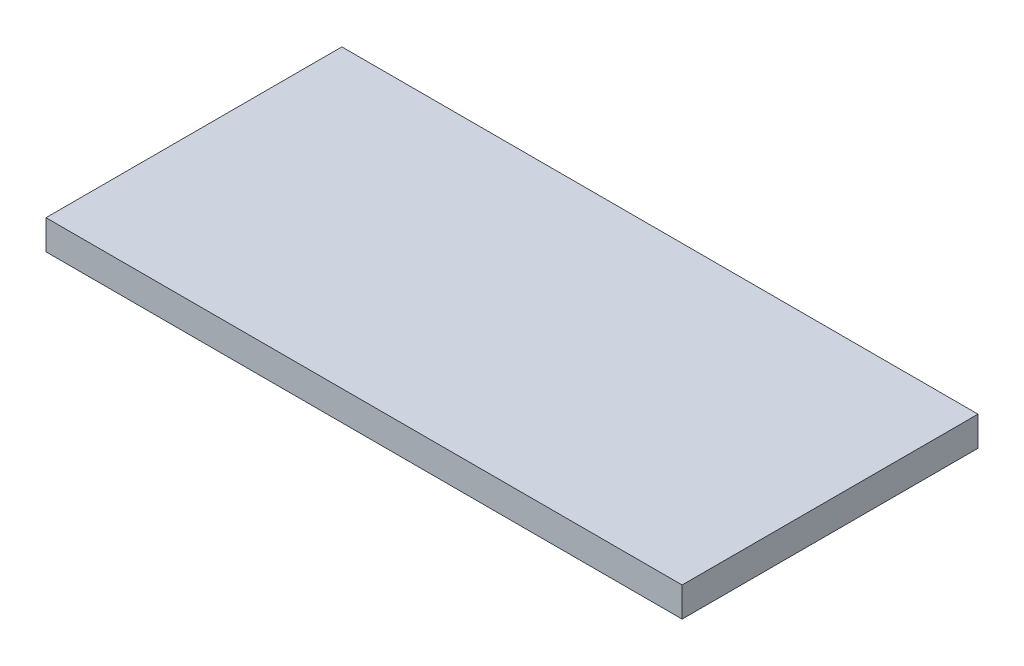
ISO-10303-21;
HEADER;
FILE_DESCRIPTION(('STEP AP214'),'2;1');
FILE_NAME('part.step','',(''),(''),'','','');
FILE_SCHEMA(('AUTOMOTIVE_DESIGN { 1 0 10303 214 1 1 1 1 }'));
ENDSEC;
DATA;
#1=APPLICATION_CONTEXT('core data for automotive mechanical design processes');
#2=APPLICATION_PROTOCOL_DEFINITION('international standard','automotive_design',2000,#1);
#3=PRODUCT_CONTEXT('',#1,'mechanical');
#4=PRODUCT('Part','Part','',(#3));
#5=PRODUCT_RELATED_PRODUCT_CATEGORY('part','',(#4));
#6=PRODUCT_DEFINITION_FORMATION('','',#4);
#7=PRODUCT_DEFINITION_CONTEXT('part definition',#1,'design');
#8=PRODUCT_DEFINITION('design','',#6,#7);
#9=PRODUCT_DEFINITION_SHAPE('','',#8);
#10=(LENGTH_UNIT() NAMED_UNIT(*) SI_UNIT(.MILLI.,.METRE.));
#11=(NAMED_UNIT(*) PLANE_ANGLE_UNIT() SI_UNIT($,.RADIAN.));
#12=(NAMED_UNIT(*) SI_UNIT($,.STERADIAN.) SOLID_ANGLE_UNIT());
#13=UNCERTAINTY_MEASURE_WITH_UNIT(LENGTH_MEASURE(1.E-05),#10,'distance_accuracy_value','');
#14=(GEOMETRIC_REPRESENTATION_CONTEXT(3) GLOBAL_UNCERTAINTY_ASSIGNED_CONTEXT((#13)) GLOBAL_UNIT_ASSIGNED_CONTEXT((#10,
#11,#12)) REPRESENTATION_CONTEXT('',''));
#15=CARTESIAN_POINT('',(0.,0.,0.));
#16=DIRECTION('',(0.,0.,1.));
#17=DIRECTION('',(1.,0.,0.));
#18=AXIS2_PLACEMENT_3D('',#15,#16,#17);
#19=CARTESIAN_POINT('',(0.,2.,0.));
#20=DIRECTION('',(1.,0.,0.));
#21=DIRECTION('',(0.,0.,-1.));
#22=AXIS2_PLACEMENT_3D('',#19,#20,#21);
#23=PLANE('',#22);
#24=DIRECTION('',(0.,0.,1.));
#25=VECTOR('',#24,1.);
#26=CARTESIAN_POINT('',(0.,0.,0.));
#27=LINE('',#26,#25);
#28=CARTESIAN_POINT('',(0.,0.,-20.));
#29=VERTEX_POINT('',#28);
#30=CARTESIAN_POINT('',(0.,0.,0.));
#31=VERTEX_POINT('',#30);
#32=EDGE_CURVE('E96',#29,#31,#27,.T.);
#33=ORIENTED_EDGE('',*,*,#32,.T.);
#34=DIRECTION('',(0.,-1.,0.));
#35=VECTOR('',#34,1.);
#36=CARTESIAN_POINT('',(0.,2.,0.));
#37=LINE('',#36,#35);
#38=CARTESIAN_POINT('',(0.,2.,0.));
#39=VERTEX_POINT('',#38);
#40=EDGE_CURVE('E11',#39,#31,#37,.T.);
#41=ORIENTED_EDGE('',*,*,#40,.F.);
#42=DIRECTION('',(0.,0.,1.));
#43=VECTOR('',#42,1.);
#44=CARTESIAN_POINT('',(0.,2.,0.));
#45=LINE('',#44,#43);
#46=CARTESIAN_POINT('',(0.,2.,-20.));
#47=VERTEX_POINT('',#46);
#48=EDGE_CURVE('E84',#47,#39,#45,.T.);
#49=ORIENTED_EDGE('',*,*,#48,.F.);
#50=DIRECTION('',(0.,-1.,0.));
#51=VECTOR('',#50,1.);
#52=CARTESIAN_POINT('',(0.,2.,-20.));
#53=LINE('',#52,#51);
#54=EDGE_CURVE('E92',#47,#29,#53,.T.);
#55=ORIENTED_EDGE('',*,*,#54,.T.);
#56=EDGE_LOOP('',(#33,#41,#49,#55));
#57=FACE_BOUND('',#56,.T.);
#58=ADVANCED_FACE('F33',(#57),#23,.F.);
#59=CARTESIAN_POINT('',(0.,2.,0.));
#60=DIRECTION('',(0.,0.,-1.));
#61=DIRECTION('',(-1.,0.,0.));
#62=AXIS2_PLACEMENT_3D('',#59,#60,#61);
#63=PLANE('',#62);
#64=DIRECTION('',(1.,0.,0.));
#65=VECTOR('',#64,1.);
#66=CARTESIAN_POINT('',(0.,0.,0.));
#67=LINE('',#66,#65);
#68=CARTESIAN_POINT('',(43.,0.,0.));
#69=VERTEX_POINT('',#68);
#70=EDGE_CURVE('E88',#31,#69,#67,.T.);
#71=ORIENTED_EDGE('',*,*,#70,.T.);
#72=DIRECTION('',(0.,-1.,0.));
#73=VECTOR('',#72,1.);
#74=CARTESIAN_POINT('',(43.,2.,0.));
#75=LINE('',#74,#73);
#76=CARTESIAN_POINT('',(43.,2.,0.));
#77=VERTEX_POINT('',#76);
#78=EDGE_CURVE('E41',#77,#69,#75,.T.);
#79=ORIENTED_EDGE('',*,*,#78,.F.);
#80=DIRECTION('',(1.,0.,0.));
#81=VECTOR('',#80,1.);
#82=CARTESIAN_POINT('',(0.,2.,0.));
#83=LINE('',#82,#81);
#84=EDGE_CURVE('E79',#39,#77,#83,.T.);
#85=ORIENTED_EDGE('',*,*,#84,.F.);
#86=ORIENTED_EDGE('',*,*,#40,.T.);
#87=EDGE_LOOP('',(#71,#79,#85,#86));
#88=FACE_BOUND('',#87,.T.);
#89=ADVANCED_FACE('F87',(#88),#63,.F.);
#90=CARTESIAN_POINT('',(43.,2.,0.));
#91=DIRECTION('',(-1.,0.,0.));
#92=DIRECTION('',(0.,0.,1.));
#93=AXIS2_PLACEMENT_3D('',#90,#91,#92);
#94=PLANE('',#93);
#95=DIRECTION('',(0.,0.,-1.));
#96=VECTOR('',#95,1.);
#97=CARTESIAN_POINT('',(43.,0.,0.));
#98=LINE('',#97,#96);
#99=CARTESIAN_POINT('',(43.,0.,-20.));
#100=VERTEX_POINT('',#99);
#101=EDGE_CURVE('E66',#69,#100,#98,.T.);
#102=ORIENTED_EDGE('',*,*,#101,.T.);
#103=DIRECTION('',(0.,-1.,0.));
#104=VECTOR('',#103,1.);
#105=CARTESIAN_POINT('',(43.,2.,-20.));
#106=LINE('',#105,#104);
#107=CARTESIAN_POINT('',(43.,2.,-20.));
#108=VERTEX_POINT('',#107);
#109=EDGE_CURVE('E89',#108,#100,#106,.T.);
#110=ORIENTED_EDGE('',*,*,#109,.F.);
#111=DIRECTION('',(0.,0.,-1.));
#112=VECTOR('',#111,1.);
#113=CARTESIAN_POINT('',(43.,2.,0.));
#114=LINE('',#113,#112);
#115=EDGE_CURVE('E82',#77,#108,#114,.T.);
#116=ORIENTED_EDGE('',*,*,#115,.F.);
#117=ORIENTED_EDGE('',*,*,#78,.T.);
#118=EDGE_LOOP('',(#102,#110,#116,#117));
#119=FACE_BOUND('',#118,.T.);
#120=ADVANCED_FACE('F90',(#119),#94,.F.);
#121=CARTESIAN_POINT('',(0.,2.,-20.));
#122=DIRECTION('',(0.,0.,1.));
#123=DIRECTION('',(1.,0.,0.));
#124=AXIS2_PLACEMENT_3D('',#121,#122,#123);
#125=PLANE('',#124);
#126=DIRECTION('',(-1.,0.,0.));
#127=VECTOR('',#126,1.);
#128=CARTESIAN_POINT('',(0.,0.,-20.));
#129=LINE('',#128,#127);
#130=EDGE_CURVE('E72',#100,#29,#129,.T.);
#131=ORIENTED_EDGE('',*,*,#130,.T.);
#132=ORIENTED_EDGE('',*,*,#54,.F.);
#133=DIRECTION('',(-1.,0.,0.));
#134=VECTOR('',#133,1.);
#135=CARTESIAN_POINT('',(0.,2.,-20.));
#136=LINE('',#135,#134);
#137=EDGE_CURVE('E49',#108,#47,#136,.T.);
#138=ORIENTED_EDGE('',*,*,#137,.F.);
#139=ORIENTED_EDGE('',*,*,#109,.T.);
#140=EDGE_LOOP('',(#131,#132,#138,#139));
#141=FACE_BOUND('',#140,.T.);
#142=ADVANCED_FACE('F103',(#141),#125,.F.);
#143=CARTESIAN_POINT('',(0.,2.,0.));
#144=DIRECTION('',(0.,-1.,0.));
#145=DIRECTION('',(0.,0.,-1.));
#146=AXIS2_PLACEMENT_3D('',#143,#144,#145);
#147=PLANE('',#146);
#148=ORIENTED_EDGE('',*,*,#48,.T.);
#149=ORIENTED_EDGE('',*,*,#84,.T.);
#150=ORIENTED_EDGE('',*,*,#115,.T.);
#151=ORIENTED_EDGE('',*,*,#137,.T.);
#152=EDGE_LOOP('',(#148,#149,#150,#151));
#153=FACE_BOUND('',#152,.T.);
#154=ADVANCED_FACE('F80',(#153),#147,.F.);
#155=CARTESIAN_POINT('',(0.,0.,0.));
#156=DIRECTION('',(0.,-1.,0.));
#157=DIRECTION('',(0.,0.,-1.));
#158=AXIS2_PLACEMENT_3D('',#155,#156,#157);
#159=PLANE('',#158);
#160=ORIENTED_EDGE('',*,*,#32,.F.);
#161=ORIENTED_EDGE('',*,*,#130,.F.);
#162=ORIENTED_EDGE('',*,*,#101,.F.);
#163=ORIENTED_EDGE('',*,*,#70,.F.);
#164=EDGE_LOOP('',(#160,#161,#162,#163));
#165=FACE_BOUND('',#164,.T.);
#166=ADVANCED_FACE('F106',(#165),#159,.T.);
#167=CLOSED_SHELL('',(#58,#89,#120,#142,#154,#166));
#168=MANIFOLD_SOLID_BREP('B2',#167);
#169=ADVANCED_BREP_SHAPE_REPRESENTATION('',(#18,#168),#14);
#170=SHAPE_DEFINITION_REPRESENTATION(#9,#169);
ENDSEC;
END-ISO-10303-21;
